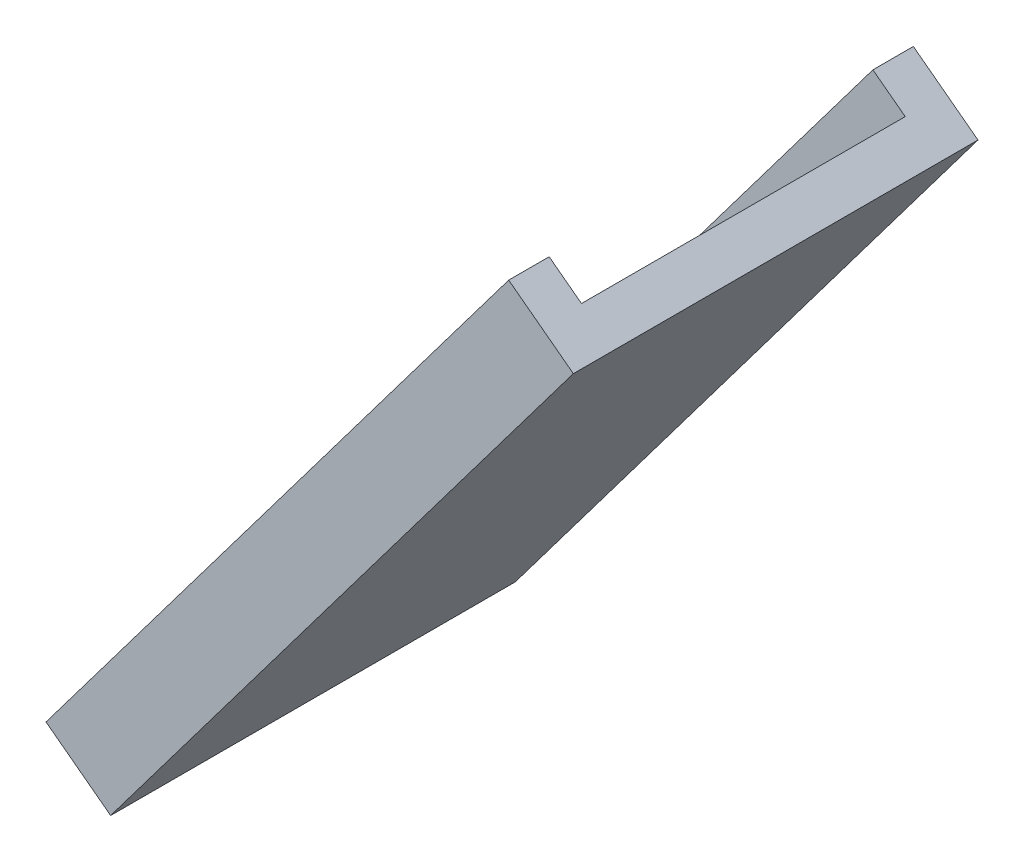
ISO-10303-21;
HEADER;
FILE_DESCRIPTION(('STEP AP214'),'2;1');
FILE_NAME('part.step','',(''),(''),'','','');
FILE_SCHEMA(('AUTOMOTIVE_DESIGN { 1 0 10303 214 1 1 1 1 }'));
ENDSEC;
DATA;
#1=APPLICATION_CONTEXT('core data for automotive mechanical design processes');
#2=APPLICATION_PROTOCOL_DEFINITION('international standard','automotive_design',2000,#1);
#3=PRODUCT_CONTEXT('',#1,'mechanical');
#4=PRODUCT('Part','Part','',(#3));
#5=PRODUCT_RELATED_PRODUCT_CATEGORY('part','',(#4));
#6=PRODUCT_DEFINITION_FORMATION('','',#4);
#7=PRODUCT_DEFINITION_CONTEXT('part definition',#1,'design');
#8=PRODUCT_DEFINITION('design','',#6,#7);
#9=PRODUCT_DEFINITION_SHAPE('','',#8);
#10=(LENGTH_UNIT() NAMED_UNIT(*) SI_UNIT(.MILLI.,.METRE.));
#11=(NAMED_UNIT(*) PLANE_ANGLE_UNIT() SI_UNIT($,.RADIAN.));
#12=(NAMED_UNIT(*) SI_UNIT($,.STERADIAN.) SOLID_ANGLE_UNIT());
#13=UNCERTAINTY_MEASURE_WITH_UNIT(LENGTH_MEASURE(1.E-05),#10,'distance_accuracy_value','');
#14=(GEOMETRIC_REPRESENTATION_CONTEXT(3) GLOBAL_UNCERTAINTY_ASSIGNED_CONTEXT((#13)) GLOBAL_UNIT_ASSIGNED_CONTEXT((#10,
#11,#12)) REPRESENTATION_CONTEXT('',''));
#15=CARTESIAN_POINT('',(0.,0.,0.));
#16=DIRECTION('',(0.,0.,1.));
#17=DIRECTION('',(1.,0.,0.));
#18=AXIS2_PLACEMENT_3D('',#15,#16,#17);
#19=CARTESIAN_POINT('',(-20.70685207874,9.684331571046,-1.611602139255));
#20=DIRECTION('',(-0.798635489731325,0.601815050112245,5.26123433841814E-08));
#21=DIRECTION('',(-0.601815050112246,-0.798635489731326,0.));
#22=AXIS2_PLACEMENT_3D('',#19,#20,#21);
#23=PLANE('',#22);
#24=DIRECTION('',(-4.20180838726443E-08,-5.57598767012264E-08,0.999999999999998));
#25=VECTOR('',#24,1.);
#26=CARTESIAN_POINT('',(-20.1351277832382,10.4430352878775,-1.611602078189));
#27=LINE('',#26,#25);
#28=CARTESIAN_POINT('',(-20.1351277821876,10.4430352892673,-1.66160207358485));
#29=VERTEX_POINT('',#28);
#30=CARTESIAN_POINT('',(-20.1351277816624,10.443035286686,-1.61160210609119));
#31=VERTEX_POINT('',#30);
#32=EDGE_CURVE('E100',#29,#31,#27,.T.);
#33=ORIENTED_EDGE('',*,*,#32,.F.);
#34=DIRECTION('',(0.601815050107669,0.798635489734772,6.98189317949345E-08));
#35=VECTOR('',#34,1.);
#36=CARTESIAN_POINT('',(-20.70685207874,9.684331575417,-1.66160213925538));
#37=LINE('',#36,#35);
#38=CARTESIAN_POINT('',(-20.7068520787403,9.6843315754167,-1.66160210674885));
#39=VERTEX_POINT('',#38);
#40=EDGE_CURVE('E99',#39,#29,#37,.T.);
#41=ORIENTED_EDGE('',*,*,#40,.F.);
#42=DIRECTION('',(-4.20180838726443E-08,-5.57598767012264E-08,0.999999999999998));
#43=VECTOR('',#42,1.);
#44=CARTESIAN_POINT('',(-20.7068520808419,9.68433157262773,-1.611602144517));
#45=LINE('',#44,#43);
#46=CARTESIAN_POINT('',(-20.7068520792657,9.68433157253384,-1.61160213925519));
#47=VERTEX_POINT('',#46);
#48=EDGE_CURVE('E84',#39,#47,#45,.T.);
#49=ORIENTED_EDGE('',*,*,#48,.T.);
#50=DIRECTION('',(0.601815050107669,0.798635489734772,6.98189315666814E-08));
#51=VECTOR('',#50,1.);
#52=CARTESIAN_POINT('',(-20.70685207874,9.684331571046,-1.61160213925577));
#53=LINE('',#52,#51);
#54=EDGE_CURVE('E110',#47,#31,#53,.T.);
#55=ORIENTED_EDGE('',*,*,#54,.T.);
#56=EDGE_LOOP('',(#33,#41,#49,#55));
#57=FACE_BOUND('',#56,.T.);
#58=ADVANCED_FACE('F17',(#57),#23,.T.);
#59=CARTESIAN_POINT('',(-20.66692030426,9.654240857881,-2.061602141886));
#60=DIRECTION('',(0.,8.74227767714697E-08,-0.999999999999996));
#61=DIRECTION('',(0.,0.999999999999996,8.74227767714697E-08));
#62=AXIS2_PLACEMENT_3D('',#59,#60,#61);
#63=PLANE('',#62);
#64=DIRECTION('',(-0.798635489731326,0.601815050112246,0.));
#65=VECTOR('',#64,1.);
#66=CARTESIAN_POINT('',(-20.6269885108619,9.62415009112694,-2.061602139255));
#67=LINE('',#66,#65);
#68=CARTESIAN_POINT('',(-20.706852078215,9.68433161217613,-2.0616021392551));
#69=VERTEX_POINT('',#68);
#70=CARTESIAN_POINT('',(-20.6669203042597,9.6542408578814,-2.06160212464625));
#71=VERTEX_POINT('',#70);
#72=EDGE_CURVE('E112',#69,#71,#67,.F.);
#73=ORIENTED_EDGE('',*,*,#72,.T.);
#74=DIRECTION('',(-0.601815050112246,-0.798635489731326,0.));
#75=VECTOR('',#74,1.);
#76=CARTESIAN_POINT('',(-20.6669203210672,9.65424083557716,-2.061602075558));
#77=LINE('',#76,#75);
#78=CARTESIAN_POINT('',(-20.095196010852,10.4129445675508,-2.06160207490026));
#79=VERTEX_POINT('',#78);
#80=EDGE_CURVE('E20',#79,#71,#77,.T.);
#81=ORIENTED_EDGE('',*,*,#80,.F.);
#82=DIRECTION('',(-0.798635489731326,0.601815050112246,0.));
#83=VECTOR('',#82,1.);
#84=CARTESIAN_POINT('',(-20.0552642132519,10.3828538063719,-2.061602072927));
#85=LINE('',#84,#83);
#86=CARTESIAN_POINT('',(-20.1351277816625,10.4430353260262,-2.0616021060911));
#87=VERTEX_POINT('',#86);
#88=EDGE_CURVE('E226',#87,#79,#85,.F.);
#89=ORIENTED_EDGE('',*,*,#88,.F.);
#90=DIRECTION('',(-0.601815050112246,-0.798635489731326,0.));
#91=VECTOR('',#90,1.);
#92=CARTESIAN_POINT('',(-20.7068520976481,9.68433158529431,-2.061602139255));
#93=LINE('',#92,#91);
#94=EDGE_CURVE('E78',#69,#87,#93,.F.);
#95=ORIENTED_EDGE('',*,*,#94,.F.);
#96=EDGE_LOOP('',(#73,#81,#89,#95));
#97=FACE_BOUND('',#96,.T.);
#98=ADVANCED_FACE('F124',(#97),#63,.F.);
#99=CARTESIAN_POINT('',(-20.66692030426,9.654240822912,-1.661602141886));
#100=DIRECTION('',(-0.798635489731325,0.601815050112245,5.26123433841814E-08));
#101=DIRECTION('',(-0.601815050112246,-0.798635489731326,0.));
#102=AXIS2_PLACEMENT_3D('',#99,#100,#101);
#103=PLANE('',#102);
#104=DIRECTION('',(-4.20180838726443E-08,-5.57598767012264E-08,0.999999999999998));
#105=VECTOR('',#104,1.);
#106=CARTESIAN_POINT('',(-20.095196025557,10.4129445480356,-1.611602078189));
#107=LINE('',#106,#105);
#108=CARTESIAN_POINT('',(-20.0951960108525,10.4129445413244,-1.661602108722));
#109=VERTEX_POINT('',#108);
#110=EDGE_CURVE('E123',#79,#109,#107,.T.);
#111=ORIENTED_EDGE('',*,*,#110,.F.);
#112=ORIENTED_EDGE('',*,*,#80,.T.);
#113=DIRECTION('',(-4.20180838726443E-08,-5.57598767012264E-08,0.999999999999998));
#114=VECTOR('',#113,1.);
#115=CARTESIAN_POINT('',(-20.666920323167,9.65424083279062,-1.611602144517));
#116=LINE('',#115,#114);
#117=CARTESIAN_POINT('',(-20.6669203000579,9.65424083723059,-1.661602141886));
#118=VERTEX_POINT('',#117);
#119=EDGE_CURVE('E108',#71,#118,#116,.T.);
#120=ORIENTED_EDGE('',*,*,#119,.T.);
#121=DIRECTION('',(-0.601815050114384,-0.798635489729712,-6.98189317944921E-08));
#122=VECTOR('',#121,1.);
#123=CARTESIAN_POINT('',(-20.09519600665,10.412944538157,-1.66160207555801));
#124=LINE('',#123,#122);
#125=EDGE_CURVE('E104',#109,#118,#124,.T.);
#126=ORIENTED_EDGE('',*,*,#125,.F.);
#127=EDGE_LOOP('',(#111,#112,#120,#126));
#128=FACE_BOUND('',#127,.T.);
#129=ADVANCED_FACE('F122',(#128),#103,.T.);
#130=CARTESIAN_POINT('',(-20.66692030426,9.654240822912,-1.661602141886));
#131=DIRECTION('',(0.,8.74227767714697E-08,-0.999999999999996));
#132=DIRECTION('',(0.,0.999999999999996,8.74227767714697E-08));
#133=AXIS2_PLACEMENT_3D('',#130,#131,#132);
#134=PLANE('',#133);
#135=DIRECTION('',(-0.798635489731326,0.601815050112246,0.));
#136=VECTOR('',#135,1.);
#137=CARTESIAN_POINT('',(-20.6269885276691,9.62415006882299,-1.661602141886));
#138=LINE('',#137,#136);
#139=EDGE_CURVE('E89',#118,#39,#138,.T.);
#140=ORIENTED_EDGE('',*,*,#139,.T.);
#141=ORIENTED_EDGE('',*,*,#40,.T.);
#142=DIRECTION('',(-0.798635489731326,0.601815050112246,0.));
#143=VECTOR('',#142,1.);
#144=CARTESIAN_POINT('',(-20.0552642300591,10.382853784068,-1.661602075558));
#145=LINE('',#144,#143);
#146=EDGE_CURVE('E240',#109,#29,#145,.T.);
#147=ORIENTED_EDGE('',*,*,#146,.F.);
#148=ORIENTED_EDGE('',*,*,#125,.T.);
#149=EDGE_LOOP('',(#140,#141,#147,#148));
#150=FACE_BOUND('',#149,.T.);
#151=ADVANCED_FACE('F106',(#150),#134,.T.);
#152=CARTESIAN_POINT('',(-20.70685207874,9.684331571046,-1.611602139255));
#153=DIRECTION('',(-0.798635489731325,0.601815050112245,5.26123433841814E-08));
#154=DIRECTION('',(-0.601815050112246,-0.798635489731326,0.));
#155=AXIS2_PLACEMENT_3D('',#152,#153,#154);
#156=PLANE('',#155);
#157=DIRECTION('',(-4.20180838726443E-08,-5.57598767012264E-08,0.999999999999998));
#158=VECTOR('',#157,1.);
#159=CARTESIAN_POINT('',(-20.1351278021467,10.4430353021261,-1.611602078189));
#160=LINE('',#159,#158);
#161=CARTESIAN_POINT('',(-20.1351277821878,10.4430353286077,-2.1116020742427));
#162=VERTEX_POINT('',#161);
#163=EDGE_CURVE('E224',#162,#87,#160,.T.);
#164=ORIENTED_EDGE('',*,*,#163,.F.);
#165=DIRECTION('',(0.601815050107669,0.798635489734772,6.98189317949345E-08));
#166=VECTOR('',#165,1.);
#167=CARTESIAN_POINT('',(-20.70685207874,9.684331614758,-2.11160213925577));
#168=LINE('',#167,#166);
#169=CARTESIAN_POINT('',(-20.7068520787406,9.68433161475707,-2.11160212530419));
#170=VERTEX_POINT('',#169);
#171=EDGE_CURVE('E225',#170,#162,#168,.T.);
#172=ORIENTED_EDGE('',*,*,#171,.F.);
#173=DIRECTION('',(-4.20180838726443E-08,-5.57598767012264E-08,0.999999999999998));
#174=VECTOR('',#173,1.);
#175=CARTESIAN_POINT('',(-20.7068520997504,9.68433158687631,-1.611602144517));
#176=LINE('',#175,#174);
#177=EDGE_CURVE('E96',#170,#69,#176,.T.);
#178=ORIENTED_EDGE('',*,*,#177,.T.);
#179=ORIENTED_EDGE('',*,*,#94,.T.);
#180=EDGE_LOOP('',(#164,#172,#178,#179));
#181=FACE_BOUND('',#180,.T.);
#182=ADVANCED_FACE('F153',(#181),#156,.T.);
#183=CARTESIAN_POINT('',(-20.62698852977,9.624150066035,-1.611602144517));
#184=DIRECTION('',(0.601815050112244,0.798635489731324,6.98189316880783E-08));
#185=DIRECTION('',(-0.798635489731326,0.601815050112246,0.));
#186=AXIS2_PLACEMENT_3D('',#183,#184,#185);
#187=PLANE('',#186);
#188=ORIENTED_EDGE('',*,*,#119,.F.);
#189=ORIENTED_EDGE('',*,*,#72,.F.);
#190=ORIENTED_EDGE('',*,*,#177,.F.);
#191=DIRECTION('',(-0.798635489716249,0.601815050132251,5.2612341567799E-08));
#192=VECTOR('',#191,1.);
#193=CARTESIAN_POINT('',(-20.62698852977,9.624150109746,-2.111602144517));
#194=LINE('',#193,#192);
#195=CARTESIAN_POINT('',(-20.6269885192655,9.6241501018305,-2.111602127935));
#196=VERTEX_POINT('',#195);
#197=EDGE_CURVE('E234',#196,#170,#194,.T.);
#198=ORIENTED_EDGE('',*,*,#197,.F.);
#199=DIRECTION('',(4.20180846245384E-08,-3.16629000702738E-08,0.999999999999999));
#200=VECTOR('',#199,1.);
#201=CARTESIAN_POINT('',(-20.6269885087611,9.62415009391469,-1.611602144517));
#202=LINE('',#201,#200);
#203=CARTESIAN_POINT('',(-20.6269885245178,9.62415007300492,-1.611602141886));
#204=VERTEX_POINT('',#203);
#205=EDGE_CURVE('E230',#196,#204,#202,.T.);
#206=ORIENTED_EDGE('',*,*,#205,.T.);
#207=DIRECTION('',(-0.798635489721052,0.601815050125878,5.26123437365197E-08));
#208=VECTOR('',#207,1.);
#209=CARTESIAN_POINT('',(-20.62698852977,9.624150066035,-1.611602144517));
#210=LINE('',#209,#208);
#211=EDGE_CURVE('E92',#204,#47,#210,.T.);
#212=ORIENTED_EDGE('',*,*,#211,.T.);
#213=ORIENTED_EDGE('',*,*,#48,.F.);
#214=ORIENTED_EDGE('',*,*,#139,.F.);
#215=EDGE_LOOP('',(#188,#189,#190,#198,#206,#212,#213,#214));
#216=FACE_BOUND('',#215,.T.);
#217=ADVANCED_FACE('F87',(#216),#187,.F.);
#218=CARTESIAN_POINT('',(-20.62698852977,9.624150066035,-1.611602144517));
#219=DIRECTION('',(0.,8.74227767714697E-08,-0.999999999999996));
#220=DIRECTION('',(0.,0.999999999999996,8.74227767714697E-08));
#221=AXIS2_PLACEMENT_3D('',#218,#219,#220);
#222=PLANE('',#221);
#223=ORIENTED_EDGE('',*,*,#54,.F.);
#224=ORIENTED_EDGE('',*,*,#211,.F.);
#225=DIRECTION('',(-0.601815050112246,-0.798635489731326,0.));
#226=VECTOR('',#225,1.);
#227=CARTESIAN_POINT('',(-20.62698852977,9.624150066035,-1.611602144517));
#228=LINE('',#227,#226);
#229=CARTESIAN_POINT('',(-20.0552642321605,10.3828537812804,-1.61160209345551));
#230=VERTEX_POINT('',#229);
#231=EDGE_CURVE('E232',#204,#230,#228,.F.);
#232=ORIENTED_EDGE('',*,*,#231,.T.);
#233=DIRECTION('',(-0.798635489731326,0.601815050112246,0.));
#234=VECTOR('',#233,1.);
#235=CARTESIAN_POINT('',(-20.05526423216,10.38285378128,-1.611602072927));
#236=LINE('',#235,#234);
#237=EDGE_CURVE('E227',#31,#230,#236,.F.);
#238=ORIENTED_EDGE('',*,*,#237,.F.);
#239=EDGE_LOOP('',(#223,#224,#232,#238));
#240=FACE_BOUND('',#239,.T.);
#241=ADVANCED_FACE('F146',(#240),#222,.F.);
#242=CARTESIAN_POINT('',(-20.05526423216,10.38285378128,-1.611602078189));
#243=DIRECTION('',(0.601815050112244,0.798635489731324,6.98189316880783E-08));
#244=DIRECTION('',(-0.798635489731326,0.601815050112246,0.));
#245=AXIS2_PLACEMENT_3D('',#242,#243,#244);
#246=PLANE('',#245);
#247=ORIENTED_EDGE('',*,*,#110,.T.);
#248=ORIENTED_EDGE('',*,*,#146,.T.);
#249=ORIENTED_EDGE('',*,*,#32,.T.);
#250=ORIENTED_EDGE('',*,*,#237,.T.);
#251=DIRECTION('',(4.20180846245384E-08,-3.16629000702738E-08,0.999999999999999));
#252=VECTOR('',#251,1.);
#253=CARTESIAN_POINT('',(-20.055264232162,10.3828537812815,-1.611602144517));
#254=LINE('',#253,#252);
#255=CARTESIAN_POINT('',(-20.0552642269082,10.382853810106,-2.111602078189));
#256=VERTEX_POINT('',#255);
#257=EDGE_CURVE('E26',#230,#256,#254,.F.);
#258=ORIENTED_EDGE('',*,*,#257,.T.);
#259=DIRECTION('',(0.798635489752485,-0.601815050084165,-5.26123415635967E-08));
#260=VECTOR('',#259,1.);
#261=CARTESIAN_POINT('',(-20.13512778114,10.443035330003,-2.11160207292778));
#262=LINE('',#261,#260);
#263=EDGE_CURVE('E34',#162,#256,#262,.T.);
#264=ORIENTED_EDGE('',*,*,#263,.F.);
#265=ORIENTED_EDGE('',*,*,#163,.T.);
#266=ORIENTED_EDGE('',*,*,#88,.T.);
#267=EDGE_LOOP('',(#247,#248,#249,#250,#258,#264,#265,#266));
#268=FACE_BOUND('',#267,.T.);
#269=ADVANCED_FACE('F140',(#268),#246,.T.);
#270=CARTESIAN_POINT('',(-20.62698852977,9.624150109746,-2.111602144517));
#271=DIRECTION('',(0.,8.74227767714697E-08,-0.999999999999996));
#272=DIRECTION('',(0.,0.999999999999996,8.74227767714697E-08));
#273=AXIS2_PLACEMENT_3D('',#270,#271,#272);
#274=PLANE('',#273);
#275=ORIENTED_EDGE('',*,*,#171,.T.);
#276=ORIENTED_EDGE('',*,*,#263,.T.);
#277=DIRECTION('',(-0.601815050112246,-0.798635489731326,0.));
#278=VECTOR('',#277,1.);
#279=CARTESIAN_POINT('',(-20.626988550779,9.62415008186645,-2.111602078189));
#280=LINE('',#279,#278);
#281=EDGE_CURVE('E11',#256,#196,#280,.T.);
#282=ORIENTED_EDGE('',*,*,#281,.T.);
#283=ORIENTED_EDGE('',*,*,#197,.T.);
#284=EDGE_LOOP('',(#275,#276,#282,#283));
#285=FACE_BOUND('',#284,.T.);
#286=ADVANCED_FACE('F134',(#285),#274,.T.);
#287=CARTESIAN_POINT('',(-20.62698852977,9.624150066035,-1.611602144517));
#288=DIRECTION('',(-0.798635489731325,0.601815050112245,5.26123433841814E-08));
#289=DIRECTION('',(-0.601815050112246,-0.798635489731326,0.));
#290=AXIS2_PLACEMENT_3D('',#287,#288,#289);
#291=PLANE('',#290);
#292=ORIENTED_EDGE('',*,*,#257,.F.);
#293=ORIENTED_EDGE('',*,*,#231,.F.);
#294=ORIENTED_EDGE('',*,*,#205,.F.);
#295=ORIENTED_EDGE('',*,*,#281,.F.);
#296=EDGE_LOOP('',(#292,#293,#294,#295));
#297=FACE_BOUND('',#296,.T.);
#298=ADVANCED_FACE('F132',(#297),#291,.F.);
#299=CLOSED_SHELL('',(#58,#98,#129,#151,#182,#217,#241,#269,#286,#298));
#300=MANIFOLD_SOLID_BREP('B1',#299);
#301=ADVANCED_BREP_SHAPE_REPRESENTATION('',(#18,#300),#14);
#302=SHAPE_DEFINITION_REPRESENTATION(#9,#301);
ENDSEC;
END-ISO-10303-21;
